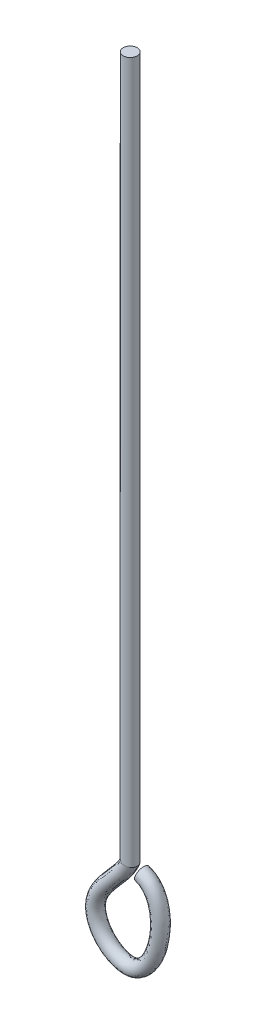
ISO-10303-21;
HEADER;
FILE_DESCRIPTION(('STEP AP214'),'2;1');
FILE_NAME('part.step','',(''),(''),'','','');
FILE_SCHEMA(('AUTOMOTIVE_DESIGN { 1 0 10303 214 1 1 1 1 }'));
ENDSEC;
DATA;
#1=APPLICATION_CONTEXT('core data for automotive mechanical design processes');
#2=APPLICATION_PROTOCOL_DEFINITION('international standard','automotive_design',2000,#1);
#3=PRODUCT_CONTEXT('',#1,'mechanical');
#4=PRODUCT('Part','Part','',(#3));
#5=PRODUCT_RELATED_PRODUCT_CATEGORY('part','',(#4));
#6=PRODUCT_DEFINITION_FORMATION('','',#4);
#7=PRODUCT_DEFINITION_CONTEXT('part definition',#1,'design');
#8=PRODUCT_DEFINITION('design','',#6,#7);
#9=PRODUCT_DEFINITION_SHAPE('','',#8);
#10=(LENGTH_UNIT() NAMED_UNIT(*) SI_UNIT(.MILLI.,.METRE.));
#11=(NAMED_UNIT(*) PLANE_ANGLE_UNIT() SI_UNIT($,.RADIAN.));
#12=(NAMED_UNIT(*) SI_UNIT($,.STERADIAN.) SOLID_ANGLE_UNIT());
#13=UNCERTAINTY_MEASURE_WITH_UNIT(LENGTH_MEASURE(1.E-05),#10,'distance_accuracy_value','');
#14=(GEOMETRIC_REPRESENTATION_CONTEXT(3) GLOBAL_UNCERTAINTY_ASSIGNED_CONTEXT((#13)) GLOBAL_UNIT_ASSIGNED_CONTEXT((#10,
#11,#12)) REPRESENTATION_CONTEXT('',''));
#15=CARTESIAN_POINT('',(0.,0.,0.));
#16=DIRECTION('',(0.,0.,1.));
#17=DIRECTION('',(1.,0.,0.));
#18=AXIS2_PLACEMENT_3D('',#15,#16,#17);
#19=CARTESIAN_POINT('',(2.4616425745316,-65.0613151289292,0.));
#20=DIRECTION('',(0.957395863710031,-0.288778739090888,0.));
#21=DIRECTION('',(0.,0.,1.));
#22=AXIS2_PLACEMENT_3D('',#19,#20,#21);
#23=PLANE('',#22);
#24=CARTESIAN_POINT('',(2.4616425745316,-65.0613151289292,0.));
#25=DIRECTION('',(0.957395863710031,-0.288778739090888,0.));
#26=DIRECTION('',(0.,0.,1.));
#27=AXIS2_PLACEMENT_3D('',#24,#25,#26);
#28=CIRCLE('',#27,1.5);
#29=CARTESIAN_POINT('',(2.4616425745316,-65.0613151289292,1.5));
#30=VERTEX_POINT('',#29);
#31=EDGE_CURVE('E36',#30,#30,#28,.T.);
#32=ORIENTED_EDGE('',*,*,#31,.F.);
#33=EDGE_LOOP('',(#32));
#34=FACE_BOUND('',#33,.T.);
#35=ADVANCED_FACE('F33',(#34),#23,.F.);
#36=CARTESIAN_POINT('',(0.,85.,0.));
#37=DIRECTION('',(0.,1.,0.));
#38=DIRECTION('',(0.,0.,1.));
#39=AXIS2_PLACEMENT_3D('',#36,#37,#38);
#40=PLANE('',#39);
#41=CARTESIAN_POINT('',(0.,85.,0.));
#42=DIRECTION('',(0.,1.,0.));
#43=DIRECTION('',(0.,0.,1.));
#44=AXIS2_PLACEMENT_3D('',#41,#42,#43);
#45=CIRCLE('',#44,1.5);
#46=CARTESIAN_POINT('',(0.,85.,1.5));
#47=VERTEX_POINT('',#46);
#48=EDGE_CURVE('E51',#47,#47,#45,.T.);
#49=ORIENTED_EDGE('',*,*,#48,.T.);
#50=EDGE_LOOP('',(#49));
#51=FACE_BOUND('',#50,.T.);
#52=ADVANCED_FACE('F63',(#51),#40,.T.);
#53=CARTESIAN_POINT('',(0.25571538062635,-63.3256250596762,1.5));
#54=CARTESIAN_POINT('',(0.213096150520723,-63.4364718286276,1.5));
#55=CARTESIAN_POINT('',(0.170476920417747,-63.5473185975688,1.5));
#56=CARTESIAN_POINT('',(0.106548075260855,-63.7135887509935,1.5));
#57=CARTESIAN_POINT('',(0.0852384602088509,-63.7690121354666,1.5));
#58=CARTESIAN_POINT('',(0.0426192301042565,-63.8798589044131,1.5));
#59=CARTESIAN_POINT('',(0.0213120855260975,-63.9352824885112,1.5));
#60=CARTESIAN_POINT('',(-0.0229619848710563,-64.0504195071134,1.5));
#61=CARTESIAN_POINT('',(-0.0469404267605389,-64.1100512033178,1.5));
#62=CARTESIAN_POINT('',(-0.0968731202008189,-64.2291589078466,1.5));
#63=CARTESIAN_POINT('',(-0.12282471163776,-64.2886351310275,1.5));
#64=CARTESIAN_POINT('',(-0.203525605111679,-64.4668457302361,1.5));
#65=CARTESIAN_POINT('',(-0.26112103204205,-64.5853620351516,1.5));
#66=CARTESIAN_POINT('',(-0.444414921810742,-64.9401571967289,1.5));
#67=CARTESIAN_POINT('',(-0.580621004634354,-65.1756822987663,1.5));
#68=CARTESIAN_POINT('',(-1.02425471186574,-65.880190822651,1.5));
#69=CARTESIAN_POINT('',(-1.36669781537685,-66.3471074595542,1.5));
#70=CARTESIAN_POINT('',(-2.4779690717942,-67.7471760945544,1.5));
#71=CARTESIAN_POINT('',(-3.33073920653886,-68.6796468119952,1.5));
#72=CARTESIAN_POINT('',(-4.96081849306839,-70.583229407548,1.5));
#73=CARTESIAN_POINT('',(-5.73812766692423,-71.5543412826653,1.5));
#74=CARTESIAN_POINT('',(-6.91797883106631,-73.5756640934347,1.5));
#75=CARTESIAN_POINT('',(-7.32052084230628,-74.6258750282745,1.5));
#76=CARTESIAN_POINT('',(-7.43899224417854,-76.6333759703863,1.5));
#77=CARTESIAN_POINT('',(-7.27160501510144,-77.5699704516691,1.5));
#78=CARTESIAN_POINT('',(-6.56707567354038,-79.3663730395517,1.5));
#79=CARTESIAN_POINT('',(-6.02993355392079,-80.2261811627956,1.5));
#80=CARTESIAN_POINT('',(-4.62427400753686,-81.7493539819384,1.5));
#81=CARTESIAN_POINT('',(-3.74124395520147,-82.4014633524704,1.5));
#82=CARTESIAN_POINT('',(-1.88192438038558,-83.2806309569962,1.5));
#83=CARTESIAN_POINT('',(-0.905634835877613,-83.5076892059402,1.5));
#84=CARTESIAN_POINT('',(0.810801423004652,-83.3733737053394,1.5));
#85=CARTESIAN_POINT('',(1.56497060247819,-83.0711277832578,1.5));
#86=CARTESIAN_POINT('',(2.93612179930035,-82.1023065041056,1.5));
#87=CARTESIAN_POINT('',(3.55310382230845,-81.4357311330417,1.5));
#88=CARTESIAN_POINT('',(5.16238517235254,-79.0594126434101,1.5));
#89=CARTESIAN_POINT('',(5.9130197894796,-76.9730771056419,1.5));
#90=CARTESIAN_POINT('',(6.57846853924177,-72.7023024340922,1.5));
#91=CARTESIAN_POINT('',(6.49328267688829,-70.5178632766859,1.5));
#92=CARTESIAN_POINT('',(5.59510258833209,-67.8472339291432,1.5));
#93=CARTESIAN_POINT('',(5.16730901195575,-67.0580290337588,1.5));
#94=CARTESIAN_POINT('',(4.03099877024509,-65.7948968962417,1.5));
#95=CARTESIAN_POINT('',(3.32248210674493,-65.3209696452853,1.5));
#96=CARTESIAN_POINT('',(2.4616425745316,-65.0613151289292,1.5));
#97=CARTESIAN_POINT('',(3.05587188332003,-64.4022510673605,1.5));
#98=CARTESIAN_POINT('',(3.0132526532144,-64.513097836312,1.5));
#99=CARTESIAN_POINT('',(2.97063342311143,-64.6239446052532,1.5));
#100=CARTESIAN_POINT('',(2.90670457795454,-64.7902147586778,1.5));
#101=CARTESIAN_POINT('',(2.88539496290253,-64.8456381431509,1.5));
#102=CARTESIAN_POINT('',(2.84277573279794,-64.9564849120974,1.5));
#103=CARTESIAN_POINT('',(2.82658870435767,-64.998594959437,1.5));
#104=CARTESIAN_POINT('',(2.77167802206946,-65.1413897341495,1.5));
#105=CARTESIAN_POINT('',(2.73101235293342,-65.2431105508294,1.5));
#106=CARTESIAN_POINT('',(2.65860044883712,-65.415839382634,1.5));
#107=CARTESIAN_POINT('',(2.62134110140182,-65.5011969395237,1.5));
#108=CARTESIAN_POINT('',(2.5067000470824,-65.7543571013449,1.5));
#109=CARTESIAN_POINT('',(2.42646316251196,-65.9192443822288,1.5));
#110=CARTESIAN_POINT('',(2.17640555127301,-66.4032715997772,1.5));
#111=CARTESIAN_POINT('',(1.99732764062961,-66.7117913063193,1.5));
#112=CARTESIAN_POINT('',(1.43567902885194,-67.6037123442083,1.5));
#113=CARTESIAN_POINT('',(1.02911213702869,-68.1541980608226,1.5));
#114=CARTESIAN_POINT('',(-0.220247954499462,-69.7282420853111,1.5));
#115=CARTESIAN_POINT('',(-1.09484288777568,-70.6809206931926,1.5));
#116=CARTESIAN_POINT('',(-2.63932680470895,-72.4845462751398,1.5));
#117=CARTESIAN_POINT('',(-3.30381099556441,-73.3349615472204,1.5));
#118=CARTESIAN_POINT('',(-4.17045487277224,-74.8196971460167,1.5));
#119=CARTESIAN_POINT('',(-4.36175443852182,-75.4130239678128,1.5));
#120=CARTESIAN_POINT('',(-4.41507519717963,-76.3165456262599,1.5));
#121=CARTESIAN_POINT('',(-4.3378397798203,-76.8338348131559,1.5));
#122=CARTESIAN_POINT('',(-3.91506274150259,-77.911827901342,1.5));
#123=CARTESIAN_POINT('',(-3.57288060526061,-78.4651043835417,1.5));
#124=CARTESIAN_POINT('',(-2.68398137448051,-79.4283156738104,1.5));
#125=CARTESIAN_POINT('',(-2.08599459019023,-79.8656695028064,1.5));
#126=CARTESIAN_POINT('',(-0.972379740383871,-80.3922353085094,1.5));
#127=CARTESIAN_POINT('',(-0.475670693936987,-80.4648722399291,1.5));
#128=CARTESIAN_POINT('',(-0.0177156920171771,-80.4290361097102,1.5));
#129=CARTESIAN_POINT('',(0.200295471201311,-80.3620593156254,1.5));
#130=CARTESIAN_POINT('',(0.838432455251842,-79.9111676046968,1.5));
#131=CARTESIAN_POINT('',(1.22981944111051,-79.5162288013325,1.5));
#132=CARTESIAN_POINT('',(2.35698278683931,-77.8518218196977,1.5));
#133=CARTESIAN_POINT('',(3.00869554998479,-76.1267207405832,1.5));
#134=CARTESIAN_POINT('',(3.55432734015157,-72.6249177404646,1.5));
#135=CARTESIAN_POINT('',(3.44085148446804,-70.8529307662594,1.5));
#136=CARTESIAN_POINT('',(2.8560775070006,-69.114176382362,1.5));
#137=CARTESIAN_POINT('',(2.60667297994673,-68.6972548371459,1.5));
#138=CARTESIAN_POINT('',(2.13097679965196,-68.1684668992496,1.5));
#139=CARTESIAN_POINT('',(1.92560428354799,-68.0331302968602,1.5));
#140=CARTESIAN_POINT('',(1.59530635725894,-67.9335027200592,1.5));
#141=CARTESIAN_POINT('',(3.05587188332003,-64.4022510673605,-1.5));
#142=CARTESIAN_POINT('',(3.0132526532144,-64.513097836312,-1.5));
#143=CARTESIAN_POINT('',(2.97063342311143,-64.6239446052532,-1.5));
#144=CARTESIAN_POINT('',(2.90670457795454,-64.7902147586778,-1.5));
#145=CARTESIAN_POINT('',(2.88539496290253,-64.8456381431509,-1.5));
#146=CARTESIAN_POINT('',(2.84277573279794,-64.9564849120974,-1.5));
#147=CARTESIAN_POINT('',(2.82658870435767,-64.998594959437,-1.5));
#148=CARTESIAN_POINT('',(2.77167802206946,-65.1413897341495,-1.5));
#149=CARTESIAN_POINT('',(2.73101235293342,-65.2431105508294,-1.5));
#150=CARTESIAN_POINT('',(2.65860044883712,-65.415839382634,-1.5));
#151=CARTESIAN_POINT('',(2.62134110140182,-65.5011969395237,-1.5));
#152=CARTESIAN_POINT('',(2.5067000470824,-65.7543571013449,-1.5));
#153=CARTESIAN_POINT('',(2.42646316251196,-65.9192443822288,-1.5));
#154=CARTESIAN_POINT('',(2.17640555127301,-66.4032715997772,-1.5));
#155=CARTESIAN_POINT('',(1.99732764062961,-66.7117913063193,-1.5));
#156=CARTESIAN_POINT('',(1.43567902885194,-67.6037123442083,-1.5));
#157=CARTESIAN_POINT('',(1.02911213702869,-68.1541980608226,-1.5));
#158=CARTESIAN_POINT('',(-0.220247954499462,-69.7282420853111,-1.5));
#159=CARTESIAN_POINT('',(-1.09484288777568,-70.6809206931926,-1.5));
#160=CARTESIAN_POINT('',(-2.63932680470895,-72.4845462751398,-1.5));
#161=CARTESIAN_POINT('',(-3.30381099556441,-73.3349615472204,-1.5));
#162=CARTESIAN_POINT('',(-4.17045487277224,-74.8196971460167,-1.5));
#163=CARTESIAN_POINT('',(-4.36175443852182,-75.4130239678128,-1.5));
#164=CARTESIAN_POINT('',(-4.41507519717963,-76.3165456262599,-1.5));
#165=CARTESIAN_POINT('',(-4.3378397798203,-76.8338348131559,-1.5));
#166=CARTESIAN_POINT('',(-3.91506274150259,-77.911827901342,-1.5));
#167=CARTESIAN_POINT('',(-3.57288060526061,-78.4651043835417,-1.5));
#168=CARTESIAN_POINT('',(-2.68398137448051,-79.4283156738104,-1.5));
#169=CARTESIAN_POINT('',(-2.08599459019023,-79.8656695028064,-1.5));
#170=CARTESIAN_POINT('',(-0.972379740383871,-80.3922353085094,-1.5));
#171=CARTESIAN_POINT('',(-0.475670693936987,-80.4648722399291,-1.5));
#172=CARTESIAN_POINT('',(-0.0177156920171773,-80.4290361097102,-1.5));
#173=CARTESIAN_POINT('',(0.200295471201311,-80.3620593156254,-1.5));
#174=CARTESIAN_POINT('',(0.838432455251842,-79.9111676046968,-1.5));
#175=CARTESIAN_POINT('',(1.22981944111051,-79.5162288013325,-1.5));
#176=CARTESIAN_POINT('',(2.35698278683931,-77.8518218196977,-1.5));
#177=CARTESIAN_POINT('',(3.00869554998479,-76.1267207405832,-1.5));
#178=CARTESIAN_POINT('',(3.55432734015157,-72.6249177404646,-1.5));
#179=CARTESIAN_POINT('',(3.44085148446804,-70.8529307662594,-1.5));
#180=CARTESIAN_POINT('',(2.8560775070006,-69.114176382362,-1.5));
#181=CARTESIAN_POINT('',(2.60667297994673,-68.6972548371459,-1.5));
#182=CARTESIAN_POINT('',(2.13097679965196,-68.1684668992496,-1.5));
#183=CARTESIAN_POINT('',(1.92560428354799,-68.0331302968602,-1.5));
#184=CARTESIAN_POINT('',(1.59530635725894,-67.9335027200592,-1.5));
#185=CARTESIAN_POINT('',(0.25571538062635,-63.3256250596762,-1.5));
#186=CARTESIAN_POINT('',(0.213096150520723,-63.4364718286276,-1.5));
#187=CARTESIAN_POINT('',(0.170476920417747,-63.5473185975688,-1.5));
#188=CARTESIAN_POINT('',(0.106548075260855,-63.7135887509935,-1.5));
#189=CARTESIAN_POINT('',(0.0852384602088509,-63.7690121354666,-1.5));
#190=CARTESIAN_POINT('',(0.0426192301042565,-63.8798589044131,-1.5));
#191=CARTESIAN_POINT('',(0.0213120855260975,-63.9352824885112,-1.5));
#192=CARTESIAN_POINT('',(-0.0229619848710563,-64.0504195071134,-1.5));
#193=CARTESIAN_POINT('',(-0.0469404267605389,-64.1100512033178,-1.5));
#194=CARTESIAN_POINT('',(-0.0968731202008189,-64.2291589078466,-1.5));
#195=CARTESIAN_POINT('',(-0.12282471163776,-64.2886351310275,-1.5));
#196=CARTESIAN_POINT('',(-0.203525605111679,-64.4668457302361,-1.5));
#197=CARTESIAN_POINT('',(-0.26112103204205,-64.5853620351516,-1.5));
#198=CARTESIAN_POINT('',(-0.444414921810742,-64.9401571967289,-1.5));
#199=CARTESIAN_POINT('',(-0.580621004634354,-65.1756822987663,-1.5));
#200=CARTESIAN_POINT('',(-1.02425471186574,-65.880190822651,-1.5));
#201=CARTESIAN_POINT('',(-1.36669781537685,-66.3471074595542,-1.5));
#202=CARTESIAN_POINT('',(-2.4779690717942,-67.7471760945544,-1.5));
#203=CARTESIAN_POINT('',(-3.33073920653886,-68.6796468119952,-1.5));
#204=CARTESIAN_POINT('',(-4.96081849306839,-70.583229407548,-1.5));
#205=CARTESIAN_POINT('',(-5.73812766692423,-71.5543412826653,-1.5));
#206=CARTESIAN_POINT('',(-6.91797883106631,-73.5756640934347,-1.5));
#207=CARTESIAN_POINT('',(-7.32052084230628,-74.6258750282745,-1.5));
#208=CARTESIAN_POINT('',(-7.43899224417854,-76.6333759703863,-1.5));
#209=CARTESIAN_POINT('',(-7.27160501510144,-77.5699704516691,-1.5));
#210=CARTESIAN_POINT('',(-6.56707567354038,-79.3663730395517,-1.5));
#211=CARTESIAN_POINT('',(-6.02993355392079,-80.2261811627956,-1.5));
#212=CARTESIAN_POINT('',(-4.62427400753686,-81.7493539819384,-1.5));
#213=CARTESIAN_POINT('',(-3.74124395520147,-82.4014633524704,-1.5));
#214=CARTESIAN_POINT('',(-1.88192438038558,-83.2806309569962,-1.5));
#215=CARTESIAN_POINT('',(-0.905634835877613,-83.5076892059402,-1.5));
#216=CARTESIAN_POINT('',(0.810801423004652,-83.3733737053394,-1.5));
#217=CARTESIAN_POINT('',(1.56497060247819,-83.0711277832578,-1.5));
#218=CARTESIAN_POINT('',(2.93612179930035,-82.1023065041056,-1.5));
#219=CARTESIAN_POINT('',(3.55310382230845,-81.4357311330417,-1.5));
#220=CARTESIAN_POINT('',(5.16238517235254,-79.0594126434101,-1.5));
#221=CARTESIAN_POINT('',(5.9130197894796,-76.9730771056419,-1.5));
#222=CARTESIAN_POINT('',(6.57846853924177,-72.7023024340922,-1.5));
#223=CARTESIAN_POINT('',(6.49328267688829,-70.5178632766859,-1.5));
#224=CARTESIAN_POINT('',(5.59510258833209,-67.8472339291432,-1.5));
#225=CARTESIAN_POINT('',(5.16730901195575,-67.0580290337588,-1.5));
#226=CARTESIAN_POINT('',(4.03099877024509,-65.7948968962417,-1.5));
#227=CARTESIAN_POINT('',(3.32248210674493,-65.3209696452853,-1.5));
#228=CARTESIAN_POINT('',(2.4616425745316,-65.0613151289292,-1.5));
#229=CARTESIAN_POINT('',(-2.54444112206733,-62.2489990519919,-1.5));
#230=CARTESIAN_POINT('',(-2.58706035217296,-62.3598458209433,-1.5));
#231=CARTESIAN_POINT('',(-2.62967958227593,-62.4706925898845,-1.5));
#232=CARTESIAN_POINT('',(-2.69360842743282,-62.6369627433092,-1.5));
#233=CARTESIAN_POINT('',(-2.71491804248483,-62.6923861277822,-1.5));
#234=CARTESIAN_POINT('',(-2.75753727258942,-62.8032328967288,-1.5));
#235=CARTESIAN_POINT('',(-2.78396453330547,-62.8719700175855,-1.5));
#236=CARTESIAN_POINT('',(-2.81760199181157,-62.9594492800774,-1.5));
#237=CARTESIAN_POINT('',(-2.82489320645449,-62.9769918558063,-1.5));
#238=CARTESIAN_POINT('',(-2.85234668923875,-63.0424784330592,-1.5));
#239=CARTESIAN_POINT('',(-2.86699052467734,-63.0760733225313,-1.5));
#240=CARTESIAN_POINT('',(-2.91375125730576,-63.1793343591273,-1.5));
#241=CARTESIAN_POINT('',(-2.94870522659606,-63.2514796880745,-1.5));
#242=CARTESIAN_POINT('',(-3.06523539489449,-63.4770427936805,-1.5));
#243=CARTESIAN_POINT('',(-3.15856964989832,-63.6395732912133,-1.5));
#244=CARTESIAN_POINT('',(-3.48418845258341,-64.1566693010936,-1.5));
#245=CARTESIAN_POINT('',(-3.76250776778239,-64.5400168582859,-1.5));
#246=CARTESIAN_POINT('',(-4.73569018908895,-65.7661101037978,-1.5));
#247=CARTESIAN_POINT('',(-5.56663552530204,-66.6783729307978,-1.5));
#248=CARTESIAN_POINT('',(-7.28231018142783,-68.6819125399563,-1.5));
#249=CARTESIAN_POINT('',(-8.17244433828404,-69.7737210181101,-1.5));
#250=CARTESIAN_POINT('',(-9.66550278936039,-72.3316310408528,-1.5));
#251=CARTESIAN_POINT('',(-10.2792872460907,-73.8387260887363,-1.5));
#252=CARTESIAN_POINT('',(-10.4629092911775,-76.9502063145127,-1.5));
#253=CARTESIAN_POINT('',(-10.2053702503826,-78.3061060901823,-1.5));
#254=CARTESIAN_POINT('',(-9.21908860557816,-80.8209181777614,-1.5));
#255=CARTESIAN_POINT('',(-8.48698650258097,-81.9872579420495,-1.5));
#256=CARTESIAN_POINT('',(-6.56456664059321,-84.0703922900664,-1.5));
#257=CARTESIAN_POINT('',(-5.3964933202127,-84.9372572021344,-1.5));
#258=CARTESIAN_POINT('',(-2.79146902038728,-86.1690266054831,-1.5));
#259=CARTESIAN_POINT('',(-1.33559897781824,-86.5505061719513,-1.5));
#260=CARTESIAN_POINT('',(1.63931853802648,-86.3177113009686,-1.5));
#261=CARTESIAN_POINT('',(2.92964573375507,-85.7801962508902,-1.5));
#262=CARTESIAN_POINT('',(5.03381114334885,-84.2934454035144,-1.5));
#263=CARTESIAN_POINT('',(5.87638820350638,-83.355233464751,-1.5));
#264=CARTESIAN_POINT('',(7.96778755786578,-80.2670034671226,-1.5));
#265=CARTESIAN_POINT('',(8.81734402897442,-77.8194334707007,-1.5));
#266=CARTESIAN_POINT('',(9.60260973833198,-72.7796871277198,-1.5));
#267=CARTESIAN_POINT('',(9.54571386930854,-70.1827957871123,-1.5));
#268=CARTESIAN_POINT('',(8.33412766966357,-66.5802914759245,-1.5));
#269=CARTESIAN_POINT('',(7.72794504396477,-65.4188032303716,-1.5));
#270=CARTESIAN_POINT('',(5.93102074083821,-63.4213268932338,-1.5));
#271=CARTESIAN_POINT('',(4.71935992994187,-62.6088089937105,-1.5));
#272=CARTESIAN_POINT('',(3.32797879180427,-62.1891275377991,-1.5));
#273=CARTESIAN_POINT('',(-2.54444112206733,-62.2489990519919,1.5));
#274=CARTESIAN_POINT('',(-2.58706035217296,-62.3598458209433,1.5));
#275=CARTESIAN_POINT('',(-2.62967958227593,-62.4706925898845,1.5));
#276=CARTESIAN_POINT('',(-2.69360842743282,-62.6369627433092,1.5));
#277=CARTESIAN_POINT('',(-2.71491804248483,-62.6923861277822,1.5));
#278=CARTESIAN_POINT('',(-2.75753727258942,-62.8032328967288,1.5));
#279=CARTESIAN_POINT('',(-2.78396453330547,-62.8719700175855,1.5));
#280=CARTESIAN_POINT('',(-2.81760199181157,-62.9594492800774,1.5));
#281=CARTESIAN_POINT('',(-2.82489320645449,-62.9769918558063,1.5));
#282=CARTESIAN_POINT('',(-2.85234668923875,-63.0424784330592,1.5));
#283=CARTESIAN_POINT('',(-2.86699052467734,-63.0760733225313,1.5));
#284=CARTESIAN_POINT('',(-2.91375125730576,-63.1793343591273,1.5));
#285=CARTESIAN_POINT('',(-2.94870522659606,-63.2514796880745,1.5));
#286=CARTESIAN_POINT('',(-3.06523539489449,-63.4770427936805,1.5));
#287=CARTESIAN_POINT('',(-3.15856964989832,-63.6395732912133,1.5));
#288=CARTESIAN_POINT('',(-3.48418845258341,-64.1566693010936,1.5));
#289=CARTESIAN_POINT('',(-3.76250776778239,-64.5400168582859,1.5));
#290=CARTESIAN_POINT('',(-4.73569018908895,-65.7661101037978,1.5));
#291=CARTESIAN_POINT('',(-5.56663552530204,-66.6783729307978,1.5));
#292=CARTESIAN_POINT('',(-7.28231018142783,-68.6819125399563,1.5));
#293=CARTESIAN_POINT('',(-8.17244433828404,-69.7737210181101,1.5));
#294=CARTESIAN_POINT('',(-9.66550278936039,-72.3316310408528,1.5));
#295=CARTESIAN_POINT('',(-10.2792872460907,-73.8387260887363,1.5));
#296=CARTESIAN_POINT('',(-10.4629092911775,-76.9502063145127,1.5));
#297=CARTESIAN_POINT('',(-10.2053702503826,-78.3061060901823,1.5));
#298=CARTESIAN_POINT('',(-9.21908860557816,-80.8209181777614,1.5));
#299=CARTESIAN_POINT('',(-8.48698650258097,-81.9872579420495,1.5));
#300=CARTESIAN_POINT('',(-6.56456664059321,-84.0703922900664,1.5));
#301=CARTESIAN_POINT('',(-5.3964933202127,-84.9372572021344,1.5));
#302=CARTESIAN_POINT('',(-2.79146902038728,-86.1690266054831,1.5));
#303=CARTESIAN_POINT('',(-1.33559897781824,-86.5505061719513,1.5));
#304=CARTESIAN_POINT('',(1.63931853802648,-86.3177113009686,1.5));
#305=CARTESIAN_POINT('',(2.92964573375507,-85.7801962508902,1.5));
#306=CARTESIAN_POINT('',(5.03381114334885,-84.2934454035144,1.5));
#307=CARTESIAN_POINT('',(5.87638820350638,-83.355233464751,1.5));
#308=CARTESIAN_POINT('',(7.96778755786578,-80.2670034671226,1.5));
#309=CARTESIAN_POINT('',(8.81734402897442,-77.8194334707007,1.5));
#310=CARTESIAN_POINT('',(9.60260973833198,-72.7796871277198,1.5));
#311=CARTESIAN_POINT('',(9.54571386930854,-70.1827957871123,1.5));
#312=CARTESIAN_POINT('',(8.33412766966357,-66.5802914759245,1.5));
#313=CARTESIAN_POINT('',(7.72794504396477,-65.4188032303716,1.5));
#314=CARTESIAN_POINT('',(5.93102074083821,-63.4213268932338,1.5));
#315=CARTESIAN_POINT('',(4.71935992994187,-62.6088089937105,1.5));
#316=CARTESIAN_POINT('',(3.32797879180427,-62.1891275377991,1.5));
#317=CARTESIAN_POINT('',(0.25571538062635,-63.3256250596762,1.5));
#318=CARTESIAN_POINT('',(0.213096150520723,-63.4364718286276,1.5));
#319=CARTESIAN_POINT('',(0.170476920417747,-63.5473185975688,1.5));
#320=CARTESIAN_POINT('',(0.106548075260855,-63.7135887509935,1.5));
#321=CARTESIAN_POINT('',(0.0852384602088509,-63.7690121354666,1.5));
#322=CARTESIAN_POINT('',(0.0426192301042565,-63.8798589044131,1.5));
#323=CARTESIAN_POINT('',(0.0213120855260975,-63.9352824885112,1.5));
#324=CARTESIAN_POINT('',(-0.0229619848710563,-64.0504195071134,1.5));
#325=CARTESIAN_POINT('',(-0.0469404267605389,-64.1100512033178,1.5));
#326=CARTESIAN_POINT('',(-0.0968731202008189,-64.2291589078466,1.5));
#327=CARTESIAN_POINT('',(-0.12282471163776,-64.2886351310275,1.5));
#328=CARTESIAN_POINT('',(-0.203525605111679,-64.4668457302361,1.5));
#329=CARTESIAN_POINT('',(-0.26112103204205,-64.5853620351516,1.5));
#330=CARTESIAN_POINT('',(-0.444414921810742,-64.9401571967289,1.5));
#331=CARTESIAN_POINT('',(-0.580621004634354,-65.1756822987663,1.5));
#332=CARTESIAN_POINT('',(-1.02425471186574,-65.880190822651,1.5));
#333=CARTESIAN_POINT('',(-1.36669781537685,-66.3471074595542,1.5));
#334=CARTESIAN_POINT('',(-2.4779690717942,-67.7471760945544,1.5));
#335=CARTESIAN_POINT('',(-3.33073920653886,-68.6796468119952,1.5));
#336=CARTESIAN_POINT('',(-4.96081849306839,-70.583229407548,1.5));
#337=CARTESIAN_POINT('',(-5.73812766692423,-71.5543412826653,1.5));
#338=CARTESIAN_POINT('',(-6.91797883106631,-73.5756640934347,1.5));
#339=CARTESIAN_POINT('',(-7.32052084230628,-74.6258750282745,1.5));
#340=CARTESIAN_POINT('',(-7.43899224417854,-76.6333759703863,1.5));
#341=CARTESIAN_POINT('',(-7.27160501510144,-77.5699704516691,1.5));
#342=CARTESIAN_POINT('',(-6.56707567354038,-79.3663730395517,1.5));
#343=CARTESIAN_POINT('',(-6.02993355392079,-80.2261811627956,1.5));
#344=CARTESIAN_POINT('',(-4.62427400753686,-81.7493539819384,1.5));
#345=CARTESIAN_POINT('',(-3.74124395520147,-82.4014633524704,1.5));
#346=CARTESIAN_POINT('',(-1.88192438038558,-83.2806309569962,1.5));
#347=CARTESIAN_POINT('',(-0.905634835877613,-83.5076892059402,1.5));
#348=CARTESIAN_POINT('',(0.810801423004652,-83.3733737053394,1.5));
#349=CARTESIAN_POINT('',(1.56497060247819,-83.0711277832578,1.5));
#350=CARTESIAN_POINT('',(2.93612179930035,-82.1023065041056,1.5));
#351=CARTESIAN_POINT('',(3.55310382230845,-81.4357311330417,1.5));
#352=CARTESIAN_POINT('',(5.16238517235254,-79.0594126434101,1.5));
#353=CARTESIAN_POINT('',(5.9130197894796,-76.9730771056419,1.5));
#354=CARTESIAN_POINT('',(6.57846853924177,-72.7023024340922,1.5));
#355=CARTESIAN_POINT('',(6.49328267688829,-70.5178632766859,1.5));
#356=CARTESIAN_POINT('',(5.59510258833209,-67.8472339291432,1.5));
#357=CARTESIAN_POINT('',(5.16730901195575,-67.0580290337588,1.5));
#358=CARTESIAN_POINT('',(4.03099877024509,-65.7948968962417,1.5));
#359=CARTESIAN_POINT('',(3.32248210674493,-65.3209696452853,1.5));
#360=CARTESIAN_POINT('',(2.4616425745316,-65.0613151289292,1.5));
#361=(BOUNDED_SURFACE() B_SPLINE_SURFACE(3,3,((#53,#54,#55,#56,#57,#58,#59,#60,#61,#62,#63,#64,
#65,#66,#67,#68,#69,#70,#71,#72,#73,#74,#75,#76,#77,#78,#79,#80,#81,#82,#83,#84,#85,#86,#87,#88,
#89,#90,#91,#92,#93,#94,#95,#96),(#97,#98,#99,#100,#101,#102,#103,#104,#105,#106,#107,#108,#109,
#110,#111,#112,#113,#114,#115,#116,#117,#118,#119,#120,#121,#122,#123,#124,#125,#126,#127,#128,
#129,#130,#131,#132,#133,#134,#135,#136,#137,#138,#139,#140),(#141,#142,#143,#144,#145,#146,
#147,#148,#149,#150,#151,#152,#153,#154,#155,#156,#157,#158,#159,#160,#161,#162,#163,#164,#165,
#166,#167,#168,#169,#170,#171,#172,#173,#174,#175,#176,#177,#178,#179,#180,#181,#182,#183,#184),
(#185,#186,#187,#188,#189,#190,#191,#192,#193,#194,#195,#196,#197,#198,#199,#200,#201,#202,#203,
#204,#205,#206,#207,#208,#209,#210,#211,#212,#213,#214,#215,#216,#217,#218,#219,#220,#221,#222,
#223,#224,#225,#226,#227,#228),(#229,#230,#231,#232,#233,#234,#235,#236,#237,#238,#239,#240,
#241,#242,#243,#244,#245,#246,#247,#248,#249,#250,#251,#252,#253,#254,#255,#256,#257,#258,#259,
#260,#261,#262,#263,#264,#265,#266,#267,#268,#269,#270,#271,#272),(#273,#274,#275,#276,#277,
#278,#279,#280,#281,#282,#283,#284,#285,#286,#287,#288,#289,#290,#291,#292,#293,#294,#295,#296,
#297,#298,#299,#300,#301,#302,#303,#304,#305,#306,#307,#308,#309,#310,#311,#312,#313,#314,#315,
#316),(#317,#318,#319,#320,#321,#322,#323,#324,#325,#326,#327,#328,#329,#330,#331,#332,#333,
#334,#335,#336,#337,#338,#339,#340,#341,#342,#343,#344,#345,#346,#347,#348,#349,#350,#351,#352,
#353,#354,#355,#356,#357,#358,#359,#360)),.UNSPECIFIED.,.T.,.F.,
.F.) B_SPLINE_SURFACE_WITH_KNOTS((4,3,4),(4,2,2,2,2,2,2,2,2,2,2,2,2,2,2,2,2,2,2,2,2,4),(0.,0.5,
1.),(-0.0173458839449957,-0.00867294197249784,-0.00433647098624892,0.,0.00467218382066287,
0.00934436764132575,0.0186887352826515,0.037377470565303,0.074754941130606,0.149509882261212,
0.224264823391818,0.299019764522424,0.3594648652793,0.419909966036176,0.483222804788442,
0.546535643540709,0.60321868809812,0.659901732655531,0.773267821770354,0.886633910885177,
0.943316955442589,1.),
.UNSPECIFIED.) GEOMETRIC_REPRESENTATION_ITEM() RATIONAL_B_SPLINE_SURFACE(((1.,1.,1.,1.,1.,1.,1.,
1.,1.,1.,1.,1.,1.,1.,1.,1.,1.,1.,1.,1.,1.,1.,1.,1.,1.,1.,1.,1.,1.,1.,1.,1.,1.,1.,1.,1.,1.,1.,1.,
1.,1.,1.,1.,1.),(0.333333333333333,0.333333333333333,0.333333333333333,0.333333333333333,
0.333333333333333,0.333333333333333,0.333333333333333,0.333333333333333,0.333333333333333,
0.333333333333333,0.333333333333333,0.333333333333333,0.333333333333333,0.333333333333333,
0.333333333333333,0.333333333333333,0.333333333333333,0.333333333333333,0.333333333333333,
0.333333333333333,0.333333333333333,0.333333333333333,0.333333333333333,0.333333333333333,
0.333333333333333,0.333333333333333,0.333333333333333,0.333333333333333,0.333333333333333,
0.333333333333333,0.333333333333333,0.333333333333333,0.333333333333333,0.333333333333333,
0.333333333333333,0.333333333333333,0.333333333333333,0.333333333333333,0.333333333333333,
0.333333333333333,0.333333333333333,0.333333333333333,0.333333333333333,0.333333333333333),
(0.333333333333333,0.333333333333333,0.333333333333333,0.333333333333333,0.333333333333333,
0.333333333333333,0.333333333333333,0.333333333333333,0.333333333333333,0.333333333333333,
0.333333333333333,0.333333333333333,0.333333333333333,0.333333333333333,0.333333333333333,
0.333333333333333,0.333333333333333,0.333333333333333,0.333333333333333,0.333333333333333,
0.333333333333333,0.333333333333333,0.333333333333333,0.333333333333333,0.333333333333333,
0.333333333333333,0.333333333333333,0.333333333333333,0.333333333333333,0.333333333333333,
0.333333333333333,0.333333333333333,0.333333333333333,0.333333333333333,0.333333333333333,
0.333333333333333,0.333333333333333,0.333333333333333,0.333333333333333,0.333333333333333,
0.333333333333333,0.333333333333333,0.333333333333333,0.333333333333333),(1.,1.,1.,1.,1.,1.,1.,
1.,1.,1.,1.,1.,1.,1.,1.,1.,1.,1.,1.,1.,1.,1.,1.,1.,1.,1.,1.,1.,1.,1.,1.,1.,1.,1.,1.,1.,1.,1.,1.,
1.,1.,1.,1.,1.),(0.333333333333333,0.333333333333333,0.333333333333333,0.333333333333333,
0.333333333333333,0.333333333333333,0.333333333333333,0.333333333333333,0.333333333333333,
0.333333333333333,0.333333333333333,0.333333333333333,0.333333333333333,0.333333333333333,
0.333333333333333,0.333333333333333,0.333333333333333,0.333333333333333,0.333333333333333,
0.333333333333333,0.333333333333333,0.333333333333333,0.333333333333333,0.333333333333333,
0.333333333333333,0.333333333333333,0.333333333333333,0.333333333333333,0.333333333333333,
0.333333333333333,0.333333333333333,0.333333333333333,0.333333333333333,0.333333333333333,
0.333333333333333,0.333333333333333,0.333333333333333,0.333333333333333,0.333333333333333,
0.333333333333333,0.333333333333333,0.333333333333333,0.333333333333333,0.333333333333333),
(0.333333333333333,0.333333333333333,0.333333333333333,0.333333333333333,0.333333333333333,
0.333333333333333,0.333333333333333,0.333333333333333,0.333333333333333,0.333333333333333,
0.333333333333333,0.333333333333333,0.333333333333333,0.333333333333333,0.333333333333333,
0.333333333333333,0.333333333333333,0.333333333333333,0.333333333333333,0.333333333333333,
0.333333333333333,0.333333333333333,0.333333333333333,0.333333333333333,0.333333333333333,
0.333333333333333,0.333333333333333,0.333333333333333,0.333333333333333,0.333333333333333,
0.333333333333333,0.333333333333333,0.333333333333333,0.333333333333333,0.333333333333333,
0.333333333333333,0.333333333333333,0.333333333333333,0.333333333333333,0.333333333333333,
0.333333333333333,0.333333333333333,0.333333333333333,0.333333333333333),(1.,1.,1.,1.,1.,1.,1.,
1.,1.,1.,1.,1.,1.,1.,1.,1.,1.,1.,1.,1.,1.,1.,1.,1.,1.,1.,1.,1.,1.,1.,1.,1.,1.,1.,1.,1.,1.,1.,1.,
1.,1.,1.,1.,1.))) REPRESENTATION_ITEM('') SURFACE());
#362=CARTESIAN_POINT('',(0.,-63.990705673361,-1.5));
#363=CARTESIAN_POINT('',(-0.00423694313139001,-63.9899191218557,-1.50000011373581));
#364=CARTESIAN_POINT('',(-0.00847436291215805,-63.9891320720551,-1.49998215215611));
#365=CARTESIAN_POINT('',(-0.0981394202271194,-63.9724692070653,-1.49922003751652));
#366=CARTESIAN_POINT('',(-0.183683337096685,-63.9564059140146,-1.49115589527697));
#367=CARTESIAN_POINT('',(-0.309980064716337,-63.9324429740947,-1.46825117090836));
#368=CARTESIAN_POINT('',(-0.351809287796733,-63.9244643698196,-1.45879044178194));
#369=CARTESIAN_POINT('',(-0.434564568588319,-63.9085948138723,-1.43631165579916));
#370=CARTESIAN_POINT('',(-0.47548988362981,-63.9007039367421,-1.42329078336387));
#371=CARTESIAN_POINT('',(-0.596257042379442,-63.8772872851363,-1.37906138413021));
#372=CARTESIAN_POINT('',(-0.674296411546261,-63.8619783451589,-1.3426484630099));
#373=CARTESIAN_POINT('',(-0.823158926801932,-63.8324880500042,-1.25689524884298));
#374=CARTESIAN_POINT('',(-0.893982386859504,-63.8183066457731,-1.20755551858383));
#375=CARTESIAN_POINT('',(-0.992991663223174,-63.7983248702274,-1.12508006677385));
#376=CARTESIAN_POINT('',(-1.02472116657065,-63.7918935862313,-1.09625850581433));
#377=CARTESIAN_POINT('',(-1.08561550688825,-63.7794999126651,-1.03598892939964));
#378=CARTESIAN_POINT('',(-1.11478276752166,-63.7735370805562,-1.00454345207662));
#379=CARTESIAN_POINT('',(-1.19815662318542,-63.7564298410362,-0.906512660930743));
#380=CARTESIAN_POINT('',(-1.24826165127652,-63.7460613512724,-0.836211022267525));
#381=CARTESIAN_POINT('',(-1.33498513946759,-63.7280189494492,-0.689186637616186));
#382=CARTESIAN_POINT('',(-1.37182929278995,-63.7203000594939,-0.612601613105652));
#383=CARTESIAN_POINT('',(-1.43212118392169,-63.7076263459198,-0.45410440361868));
#384=CARTESIAN_POINT('',(-1.45557088214328,-63.702671117814,-0.37219300016665));
#385=CARTESIAN_POINT('',(-1.48796985049474,-63.6958155604495,-0.207091548115236));
#386=CARTESIAN_POINT('',(-1.49719238753804,-63.693857665937,-0.123957390850669));
#387=CARTESIAN_POINT('',(-1.50170701895502,-63.6928998920219,0.0427025453601629));
#388=CARTESIAN_POINT('',(-1.49700011321429,-63.6938998003017,0.126228295767314));
#389=CARTESIAN_POINT('',(-1.47392141488311,-63.6987894169689,0.29045614707439));
#390=CARTESIAN_POINT('',(-1.45568200477961,-63.7026511291734,0.371177724933778));
#391=CARTESIAN_POINT('',(-1.4062786621007,-63.7130644233616,0.528367238644479));
#392=CARTESIAN_POINT('',(-1.37511432126864,-63.7196160903121,0.604835040046245));
#393=CARTESIAN_POINT('',(-1.30055967508795,-63.7351938105268,0.751914315761009));
#394=CARTESIAN_POINT('',(-1.2570963822327,-63.7442346265881,0.82248746815292));
#395=CARTESIAN_POINT('',(-1.18385522655209,-63.7593540062424,0.922058127936262));
#396=CARTESIAN_POINT('',(-1.15809479828413,-63.7646546502101,0.954205693662515));
#397=CARTESIAN_POINT('',(-1.10404183989173,-63.7757337191727,1.01626070564));
#398=CARTESIAN_POINT('',(-1.07574705902367,-63.7815125685051,1.04616611647578));
#399=CARTESIAN_POINT('',(-0.986377399800489,-63.7996872168941,1.1331543563874));
#400=CARTESIAN_POINT('',(-0.921630168484684,-63.8127525167044,1.18640452412361));
#401=CARTESIAN_POINT('',(-0.784372984625638,-63.8401972703595,1.28129749241081));
#402=CARTESIAN_POINT('',(-0.711861932363055,-63.8545769103339,1.32293864556517));
#403=CARTESIAN_POINT('',(-0.597615964725333,-63.8769792596513,1.37648316305954));
#404=CARTESIAN_POINT('',(-0.557945411621989,-63.8847152211479,1.39303192715599));
#405=CARTESIAN_POINT('',(-0.477399864167889,-63.9003342419466,1.42264919084165));
#406=CARTESIAN_POINT('',(-0.436525940791328,-63.9082171682902,1.43572068698629));
#407=CARTESIAN_POINT('',(-0.312597845853219,-63.931986668694,1.46955331683062));
#408=CARTESIAN_POINT('',(-0.228039759541597,-63.9480327299065,1.48502489399305));
#409=CARTESIAN_POINT('',(-0.099602061278149,-63.9721543868481,1.49732379173368));
#410=CARTESIAN_POINT('',(-0.0561659950159382,-63.9802693211079,1.49957807936452));
#411=CARTESIAN_POINT('',(-0.00847484060746723,-63.9891319831137,1.4999820227277));
#412=CARTESIAN_POINT('',(-0.00423744186959777,-63.9899190290077,1.49999997699706));
#413=CARTESIAN_POINT('',(0.,-63.990705673361,1.5));
#414=B_SPLINE_CURVE_WITH_KNOTS('',3,(#362,#363,#364,#365,#366,#367,#368,#369,#370,#371,#372,
#373,#374,#375,#376,#377,#378,#379,#380,#381,#382,#383,#384,#385,#386,#387,#388,#389,#390,#391,
#392,#393,#394,#395,#396,#397,#398,#399,#400,#401,#402,#403,#404,#405,#406,#407,#408,#409,#410,
#411,#412,#413),.UNSPECIFIED.,.F.,.F.,(4,2,2,2,2,2,2,2,2,2,2,2,2,2,2,2,2,2,2,2,2,2,2,2,2,4),(0.,
0.0129295966978292,0.273575575797562,0.404327531484231,0.535183194415497,0.796262810832586,
1.05733106265665,1.18722749784522,1.31699970841613,1.57644131950468,1.83123142951041,
2.08598423887886,2.33578014378695,2.58555811823857,2.83292431872541,3.08029833330385,
3.32917232443805,3.45365675170644,3.57825285028565,3.83153943317105,4.08486194083819,
4.21574454312091,4.34651398849622,4.60739644790287,4.73999294935565,4.75292254605349),.UNSPECIFIED.);
#415=CARTESIAN_POINT('',(0.,-63.990705673361,1.5));
#416=VERTEX_POINT('',#415);
#417=CARTESIAN_POINT('',(0.,-63.990705673361,-1.5));
#418=VERTEX_POINT('',#417);
#419=EDGE_CURVE('E41',#416,#418,#414,.F.);
#420=CARTESIAN_POINT('',(0.,-63.990705673361,-1.5));
#421=CARTESIAN_POINT('',(0.00423694215610981,-63.9914922229852,-1.50000011363758));
#422=CARTESIAN_POINT('',(0.00847443635049517,-63.9922788728726,-1.49998215203948));
#423=CARTESIAN_POINT('',(0.0979130764466154,-64.0088822471073,-1.49922195125247));
#424=CARTESIAN_POINT('',(0.183260024395979,-64.024725162486,-1.49119840211738));
#425=CARTESIAN_POINT('',(0.30931563603815,-64.0481240215989,-1.46838875222489));
#426=CARTESIAN_POINT('',(0.35107296952871,-64.0558750217033,-1.45896568477907));
#427=CARTESIAN_POINT('',(0.433702342521403,-64.0712125090008,-1.43657013906279));
#428=CARTESIAN_POINT('',(0.474573650480793,-64.0787988602578,-1.42359483998139));
#429=CARTESIAN_POINT('',(0.595215089371486,-64.1011916290726,-1.37950464257728));
#430=CARTESIAN_POINT('',(0.673207967983648,-64.1156680006349,-1.34318996626837));
#431=CARTESIAN_POINT('',(0.822017834531733,-64.143289130226,-1.25763678684883));
#432=CARTESIAN_POINT('',(0.892835175134912,-64.1564339536985,-1.20839891932172));
#433=CARTESIAN_POINT('',(0.991786661419802,-64.1748012435967,-1.12613824516448));
#434=CARTESIAN_POINT('',(1.023462585099,-64.1806809581886,-1.0974290671039));
#435=CARTESIAN_POINT('',(1.08426356975762,-64.1919668653928,-1.0373989017533));
#436=CARTESIAN_POINT('',(1.11339104425423,-64.1973735060316,-1.00608044170579));
#437=CARTESIAN_POINT('',(1.19666712454089,-64.2128312161892,-0.908454720027023));
#438=CARTESIAN_POINT('',(1.24673508460043,-64.2221248439072,-0.838455742674505));
#439=CARTESIAN_POINT('',(1.33353359536368,-64.2382364011871,-0.691973981719823));
#440=CARTESIAN_POINT('',(1.37046793926712,-64.2450921589732,-0.615615254588803));
#441=CARTESIAN_POINT('',(1.4309969559662,-64.2563275641486,-0.457601611731985));
#442=CARTESIAN_POINT('',(1.4545931383189,-64.2607074917419,-0.375947296505078));
#443=CARTESIAN_POINT('',(1.4874348277223,-64.2668035717895,-0.210970886105316));
#444=CARTESIAN_POINT('',(1.49688774933304,-64.2685582245748,-0.127691417422171));
#445=CARTESIAN_POINT('',(1.50180956186132,-64.2694718121624,0.0392921191869271));
#446=CARTESIAN_POINT('',(1.49727915615794,-64.268630877526,0.122996165544641));
#447=CARTESIAN_POINT('',(1.47445426167106,-64.2643941168727,0.287857607650946));
#448=CARTESIAN_POINT('',(1.45625352789106,-64.2610156936752,0.3690284450293));
#449=CARTESIAN_POINT('',(1.40677204625399,-64.2518309328304,0.527121409559322));
#450=CARTESIAN_POINT('',(1.37549115874751,-64.2460245692614,0.604043491339502));
#451=CARTESIAN_POINT('',(1.30061230456279,-64.2321255441688,0.751858532677225));
#452=CARTESIAN_POINT('',(1.25696421452354,-64.22402357874,0.822725397388005));
#453=CARTESIAN_POINT('',(1.18336094991177,-64.2103613280951,0.922700545730497));
#454=CARTESIAN_POINT('',(1.15746524626454,-64.205554562988,0.954977324111984));
#455=CARTESIAN_POINT('',(1.10311508011385,-64.1954660771583,1.01727433041761));
#456=CARTESIAN_POINT('',(1.07465824425007,-64.1901839158936,1.04729241696459));
#457=CARTESIAN_POINT('',(0.984020102930179,-64.1733596436337,1.13530784352696));
#458=CARTESIAN_POINT('',(0.918008200376703,-64.1611064865245,1.18931098656316));
#459=CARTESIAN_POINT('',(0.778002681608491,-64.1351192275512,1.28526919778083));
#460=CARTESIAN_POINT('',(0.704008138432418,-64.1213849536968,1.32722286467527));
#461=CARTESIAN_POINT('',(0.588671212075086,-64.099976952487,1.38031372116147));
#462=CARTESIAN_POINT('',(0.549461594208786,-64.092699134673,1.39638143133635));
#463=CARTESIAN_POINT('',(0.469902709651906,-64.0779318604279,1.42512462304775));
#464=CARTESIAN_POINT('',(0.429554498855617,-64.070442600079,1.43780314026898));
#465=CARTESIAN_POINT('',(0.307285444190427,-64.0477472645302,1.47060174205846));
#466=CARTESIAN_POINT('',(0.223946467552771,-64.0322776805309,1.48557372377207));
#467=CARTESIAN_POINT('',(0.0977116249071145,-64.0088446308193,1.49742128855476));
#468=CARTESIAN_POINT('',(0.0552169523570587,-64.0009561457203,1.499586110304));
#469=CARTESIAN_POINT('',(0.00847491864382774,-63.9922789624086,1.49998202280695));
#470=CARTESIAN_POINT('',(0.00423744586718796,-63.9914923164974,1.49999997704726));
#471=CARTESIAN_POINT('',(0.,-63.990705673361,1.5));
#472=B_SPLINE_CURVE_WITH_KNOTS('',3,(#420,#421,#422,#423,#424,#425,#426,#427,#428,#429,#430,
#431,#432,#433,#434,#435,#436,#437,#438,#439,#440,#441,#442,#443,#444,#445,#446,#447,#448,#449,
#450,#451,#452,#453,#454,#455,#456,#457,#458,#459,#460,#461,#462,#463,#464,#465,#466,#467,#468,
#469,#470,#471),.UNSPECIFIED.,.F.,.F.,(4,2,2,2,2,2,2,2,2,2,2,2,2,2,2,2,2,2,2,2,2,2,2,2,2,4),(0.,
0.0129295966487727,0.272875150475542,0.403272514939244,0.533773729219995,0.794178875730749,
1.05457121749292,1.1838910677436,1.31308708868959,1.57137916420849,1.82546778671528,
2.0795276467791,2.32982382784586,2.58010741890307,2.82868999115992,3.0772752174601,
3.32688271784889,3.45173726134108,3.57670872086843,3.8338826876262,4.09108655018655,
4.21993645837254,4.3486705666132,4.60549810387917,4.73519356503758,4.74812316168635),.UNSPECIFIED.);
#473=EDGE_CURVE('E11',#416,#418,#472,.F.);
#474=ORIENTED_EDGE('',*,*,#419,.T.);
#475=ORIENTED_EDGE('',*,*,#473,.F.);
#476=EDGE_LOOP('',(#474,#475));
#477=FACE_BOUND('',#476,.T.);
#478=ORIENTED_EDGE('',*,*,#31,.T.);
#479=EDGE_LOOP('',(#478));
#480=FACE_BOUND('',#479,.T.);
#481=ADVANCED_FACE('F61',(#477,#480),#361,.F.);
#482=CARTESIAN_POINT('',(0.,85.,0.));
#483=DIRECTION('',(0.,-1.,0.));
#484=DIRECTION('',(1.,0.,0.));
#485=AXIS2_PLACEMENT_3D('',#482,#483,#484);
#486=CYLINDRICAL_SURFACE('',#485,1.5);
#487=ORIENTED_EDGE('',*,*,#473,.T.);
#488=ORIENTED_EDGE('',*,*,#419,.F.);
#489=EDGE_LOOP('',(#487,#488));
#490=FACE_BOUND('',#489,.T.);
#491=ORIENTED_EDGE('',*,*,#48,.F.);
#492=EDGE_LOOP('',(#491));
#493=FACE_BOUND('',#492,.T.);
#494=ADVANCED_FACE('F59',(#490,#493),#486,.T.);
#495=CLOSED_SHELL('',(#35,#52,#481,#494));
#496=MANIFOLD_SOLID_BREP('B2',#495);
#497=ADVANCED_BREP_SHAPE_REPRESENTATION('',(#18,#496),#14);
#498=SHAPE_DEFINITION_REPRESENTATION(#9,#497);
ENDSEC;
END-ISO-10303-21;
